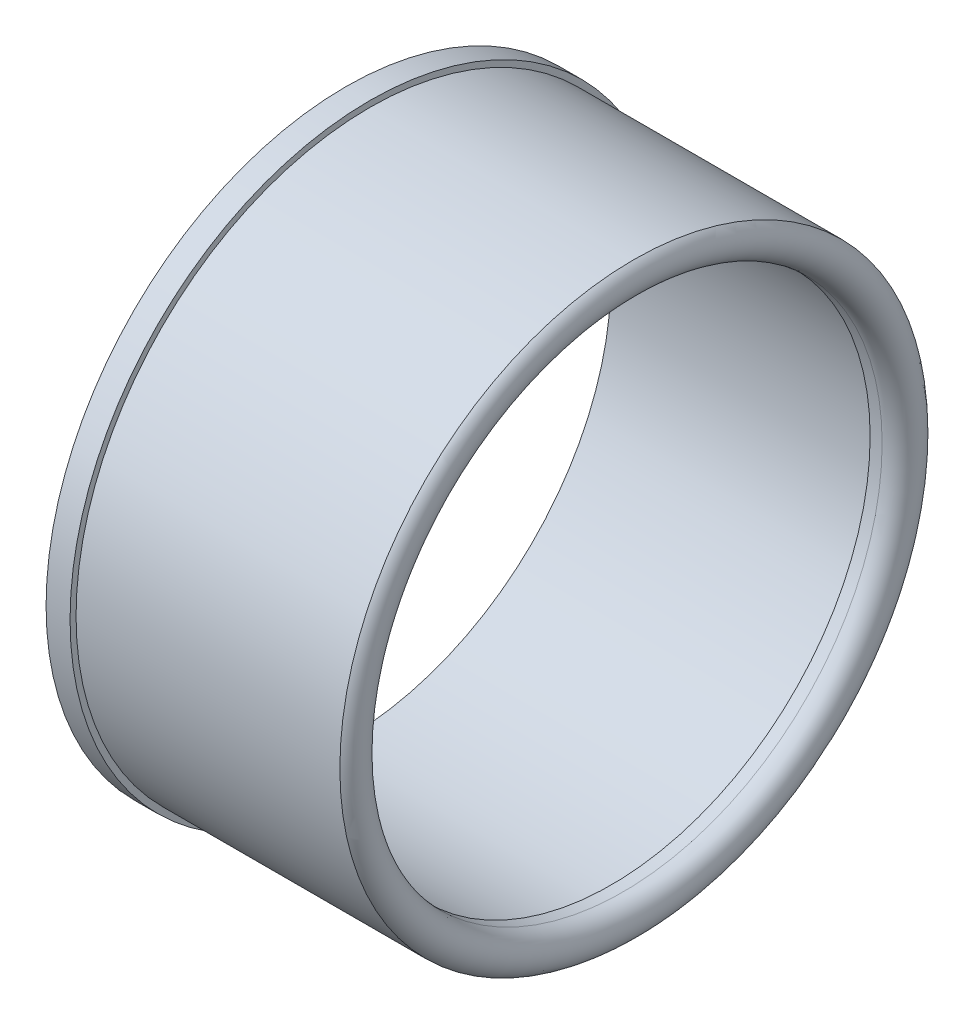
ISO-10303-21;
HEADER;
FILE_DESCRIPTION(('STEP AP214'),'2;1');
FILE_NAME('part.step','',(''),(''),'','','');
FILE_SCHEMA(('AUTOMOTIVE_DESIGN { 1 0 10303 214 1 1 1 1 }'));
ENDSEC;
DATA;
#1=APPLICATION_CONTEXT('core data for automotive mechanical design processes');
#2=APPLICATION_PROTOCOL_DEFINITION('international standard','automotive_design',2000,#1);
#3=PRODUCT_CONTEXT('',#1,'mechanical');
#4=PRODUCT('Part','Part','',(#3));
#5=PRODUCT_RELATED_PRODUCT_CATEGORY('part','',(#4));
#6=PRODUCT_DEFINITION_FORMATION('','',#4);
#7=PRODUCT_DEFINITION_CONTEXT('part definition',#1,'design');
#8=PRODUCT_DEFINITION('design','',#6,#7);
#9=PRODUCT_DEFINITION_SHAPE('','',#8);
#10=(LENGTH_UNIT() NAMED_UNIT(*) SI_UNIT(.MILLI.,.METRE.));
#11=(NAMED_UNIT(*) PLANE_ANGLE_UNIT() SI_UNIT($,.RADIAN.));
#12=(NAMED_UNIT(*) SI_UNIT($,.STERADIAN.) SOLID_ANGLE_UNIT());
#13=UNCERTAINTY_MEASURE_WITH_UNIT(LENGTH_MEASURE(1.E-05),#10,'distance_accuracy_value','');
#14=(GEOMETRIC_REPRESENTATION_CONTEXT(3) GLOBAL_UNCERTAINTY_ASSIGNED_CONTEXT((#13)) GLOBAL_UNIT_ASSIGNED_CONTEXT((#10,
#11,#12)) REPRESENTATION_CONTEXT('',''));
#15=CARTESIAN_POINT('',(0.,0.,0.));
#16=DIRECTION('',(0.,0.,1.));
#17=DIRECTION('',(1.,0.,0.));
#18=AXIS2_PLACEMENT_3D('',#15,#16,#17);
#19=CARTESIAN_POINT('',(12.1757416936097,-8.53326323507829,0.));
#20=DIRECTION('',(-1.,0.,0.));
#21=DIRECTION('',(0.,0.,1.));
#22=AXIS2_PLACEMENT_3D('',#19,#20,#21);
#23=CYLINDRICAL_SURFACE('',#22,10.8);
#24=CARTESIAN_POINT('',(11.9728126653829,-8.53326323507829,0.));
#25=DIRECTION('',(-1.,0.,0.));
#26=DIRECTION('',(0.,0.,1.));
#27=AXIS2_PLACEMENT_3D('',#24,#25,#26);
#28=CIRCLE('',#27,10.8);
#29=CARTESIAN_POINT('',(11.9728126653829,-8.53326323507829,10.8));
#30=VERTEX_POINT('',#29);
#31=EDGE_CURVE('E10',#30,#30,#28,.T.);
#32=ORIENTED_EDGE('',*,*,#31,.T.);
#33=EDGE_LOOP('',(#32));
#34=FACE_BOUND('',#33,.T.);
#35=CARTESIAN_POINT('',(12.4728126653829,-8.53326323507829,0.));
#36=DIRECTION('',(-1.,0.,0.));
#37=DIRECTION('',(0.,0.,1.));
#38=AXIS2_PLACEMENT_3D('',#35,#36,#37);
#39=CIRCLE('',#38,10.8);
#40=CARTESIAN_POINT('',(12.4728126653829,-8.53326323507829,10.8));
#41=VERTEX_POINT('',#40);
#42=EDGE_CURVE('E61',#41,#41,#39,.T.);
#43=ORIENTED_EDGE('',*,*,#42,.F.);
#44=EDGE_LOOP('',(#43));
#45=FACE_BOUND('',#44,.T.);
#46=ADVANCED_FACE('F33',(#34,#45),#23,.F.);
#47=CARTESIAN_POINT('',(11.9728126653829,2.26673676492171,0.));
#48=DIRECTION('',(-1.,0.,0.));
#49=DIRECTION('',(0.,0.,1.));
#50=AXIS2_PLACEMENT_3D('',#47,#48,#49);
#51=PLANE('',#50);
#52=CARTESIAN_POINT('',(11.9728126653829,-8.53326323507829,0.));
#53=DIRECTION('',(-1.,0.,0.));
#54=DIRECTION('',(0.,0.,1.));
#55=AXIS2_PLACEMENT_3D('',#52,#53,#54);
#56=CIRCLE('',#55,11.05);
#57=CARTESIAN_POINT('',(11.9728126653829,-8.53326323507829,11.05));
#58=VERTEX_POINT('',#57);
#59=EDGE_CURVE('E39',#58,#58,#56,.T.);
#60=ORIENTED_EDGE('',*,*,#59,.T.);
#61=EDGE_LOOP('',(#60));
#62=FACE_BOUND('',#61,.T.);
#63=ORIENTED_EDGE('',*,*,#31,.F.);
#64=EDGE_LOOP('',(#63));
#65=FACE_BOUND('',#64,.T.);
#66=ADVANCED_FACE('F69',(#62,#65),#51,.T.);
#67=CARTESIAN_POINT('',(12.1757416936097,-8.53326323507829,0.));
#68=DIRECTION('',(-1.,0.,0.));
#69=DIRECTION('',(0.,0.,1.));
#70=AXIS2_PLACEMENT_3D('',#67,#68,#69);
#71=CYLINDRICAL_SURFACE('',#70,11.05);
#72=CARTESIAN_POINT('',(0.912123334161097,-8.53326323507829,0.));
#73=DIRECTION('',(-1.,0.,0.));
#74=DIRECTION('',(0.,0.,1.));
#75=AXIS2_PLACEMENT_3D('',#72,#73,#74);
#76=CIRCLE('',#75,11.05);
#77=CARTESIAN_POINT('',(0.912123334161097,-8.53326323507829,11.05));
#78=VERTEX_POINT('',#77);
#79=EDGE_CURVE('E43',#78,#78,#76,.T.);
#80=ORIENTED_EDGE('',*,*,#79,.T.);
#81=EDGE_LOOP('',(#80));
#82=FACE_BOUND('',#81,.T.);
#83=ORIENTED_EDGE('',*,*,#59,.F.);
#84=EDGE_LOOP('',(#83));
#85=FACE_BOUND('',#84,.T.);
#86=ADVANCED_FACE('F73',(#82,#85),#71,.F.);
#87=CARTESIAN_POINT('',(0.912123334161096,2.51673676492171,0.));
#88=DIRECTION('',(-1.,0.,0.));
#89=DIRECTION('',(0.,0.,1.));
#90=AXIS2_PLACEMENT_3D('',#87,#88,#89);
#91=PLANE('',#90);
#92=CARTESIAN_POINT('',(0.912123334161097,-8.53326323507829,0.));
#93=DIRECTION('',(-1.,0.,0.));
#94=DIRECTION('',(0.,0.,1.));
#95=AXIS2_PLACEMENT_3D('',#92,#93,#94);
#96=CIRCLE('',#95,12.5);
#97=CARTESIAN_POINT('',(0.912123334161097,-8.53326323507829,12.5));
#98=VERTEX_POINT('',#97);
#99=EDGE_CURVE('E47',#98,#98,#96,.T.);
#100=ORIENTED_EDGE('',*,*,#99,.T.);
#101=EDGE_LOOP('',(#100));
#102=FACE_BOUND('',#101,.T.);
#103=ORIENTED_EDGE('',*,*,#79,.F.);
#104=EDGE_LOOP('',(#103));
#105=FACE_BOUND('',#104,.T.);
#106=ADVANCED_FACE('F77',(#102,#105),#91,.T.);
#107=CARTESIAN_POINT('',(12.1757416936097,-8.53326323507829,0.));
#108=DIRECTION('',(-1.,0.,0.));
#109=DIRECTION('',(0.,0.,1.));
#110=AXIS2_PLACEMENT_3D('',#107,#108,#109);
#111=CYLINDRICAL_SURFACE('',#110,12.5);
#112=CARTESIAN_POINT('',(1.9121233341611,-8.53326323507829,0.));
#113=DIRECTION('',(-1.,0.,0.));
#114=DIRECTION('',(0.,0.,1.));
#115=AXIS2_PLACEMENT_3D('',#112,#113,#114);
#116=CIRCLE('',#115,12.5);
#117=CARTESIAN_POINT('',(1.9121233341611,-8.53326323507829,12.5));
#118=VERTEX_POINT('',#117);
#119=EDGE_CURVE('E52',#118,#118,#116,.T.);
#120=ORIENTED_EDGE('',*,*,#119,.T.);
#121=EDGE_LOOP('',(#120));
#122=FACE_BOUND('',#121,.T.);
#123=ORIENTED_EDGE('',*,*,#99,.F.);
#124=EDGE_LOOP('',(#123));
#125=FACE_BOUND('',#124,.T.);
#126=ADVANCED_FACE('F84',(#122,#125),#111,.T.);
#127=CARTESIAN_POINT('',(1.9121233341611,3.96673676492171,0.));
#128=DIRECTION('',(1.,0.,0.));
#129=DIRECTION('',(0.,0.,-1.));
#130=AXIS2_PLACEMENT_3D('',#127,#128,#129);
#131=PLANE('',#130);
#132=CARTESIAN_POINT('',(1.9121233341611,-8.53326323507829,0.));
#133=DIRECTION('',(-1.,0.,0.));
#134=DIRECTION('',(0.,0.,1.));
#135=AXIS2_PLACEMENT_3D('',#132,#133,#134);
#136=CIRCLE('',#135,12.25);
#137=CARTESIAN_POINT('',(1.9121233341611,-8.53326323507829,12.25));
#138=VERTEX_POINT('',#137);
#139=EDGE_CURVE('E55',#138,#138,#136,.T.);
#140=ORIENTED_EDGE('',*,*,#139,.T.);
#141=EDGE_LOOP('',(#140));
#142=FACE_BOUND('',#141,.T.);
#143=ORIENTED_EDGE('',*,*,#119,.F.);
#144=EDGE_LOOP('',(#143));
#145=FACE_BOUND('',#144,.T.);
#146=ADVANCED_FACE('F88',(#142,#145),#131,.T.);
#147=CARTESIAN_POINT('',(12.1757416936097,-8.53326323507829,0.));
#148=DIRECTION('',(-1.,0.,0.));
#149=DIRECTION('',(0.,0.,1.));
#150=AXIS2_PLACEMENT_3D('',#147,#148,#149);
#151=CYLINDRICAL_SURFACE('',#150,12.25);
#152=CARTESIAN_POINT('',(12.9121233341611,-8.53326323507829,0.));
#153=DIRECTION('',(-1.,0.,0.));
#154=DIRECTION('',(0.,0.,1.));
#155=AXIS2_PLACEMENT_3D('',#152,#153,#154);
#156=CIRCLE('',#155,12.25);
#157=CARTESIAN_POINT('',(12.9121233341611,-8.53326323507829,12.25));
#158=VERTEX_POINT('',#157);
#159=EDGE_CURVE('E58',#158,#158,#156,.T.);
#160=ORIENTED_EDGE('',*,*,#159,.T.);
#161=EDGE_LOOP('',(#160));
#162=FACE_BOUND('',#161,.T.);
#163=ORIENTED_EDGE('',*,*,#139,.F.);
#164=EDGE_LOOP('',(#163));
#165=FACE_BOUND('',#164,.T.);
#166=ADVANCED_FACE('F92',(#162,#165),#151,.T.);
#167=CARTESIAN_POINT('',(12.4728126653829,-8.53326323507829,0.));
#168=DIRECTION('',(-1.,0.,0.));
#169=DIRECTION('',(0.,0.,1.));
#170=AXIS2_PLACEMENT_3D('',#167,#168,#169);
#171=TOROIDAL_SURFACE('',#170,11.5915496081732,0.791549608173222);
#172=ORIENTED_EDGE('',*,*,#42,.T.);
#173=EDGE_LOOP('',(#172));
#174=FACE_BOUND('',#173,.T.);
#175=ORIENTED_EDGE('',*,*,#159,.F.);
#176=EDGE_LOOP('',(#175));
#177=FACE_BOUND('',#176,.T.);
#178=ADVANCED_FACE('F65',(#174,#177),#171,.T.);
#179=CLOSED_SHELL('',(#46,#66,#86,#106,#126,#146,#166,#178));
#180=MANIFOLD_SOLID_BREP('B2',#179);
#181=ADVANCED_BREP_SHAPE_REPRESENTATION('',(#18,#180),#14);
#182=SHAPE_DEFINITION_REPRESENTATION(#9,#181);
ENDSEC;
END-ISO-10303-21;
